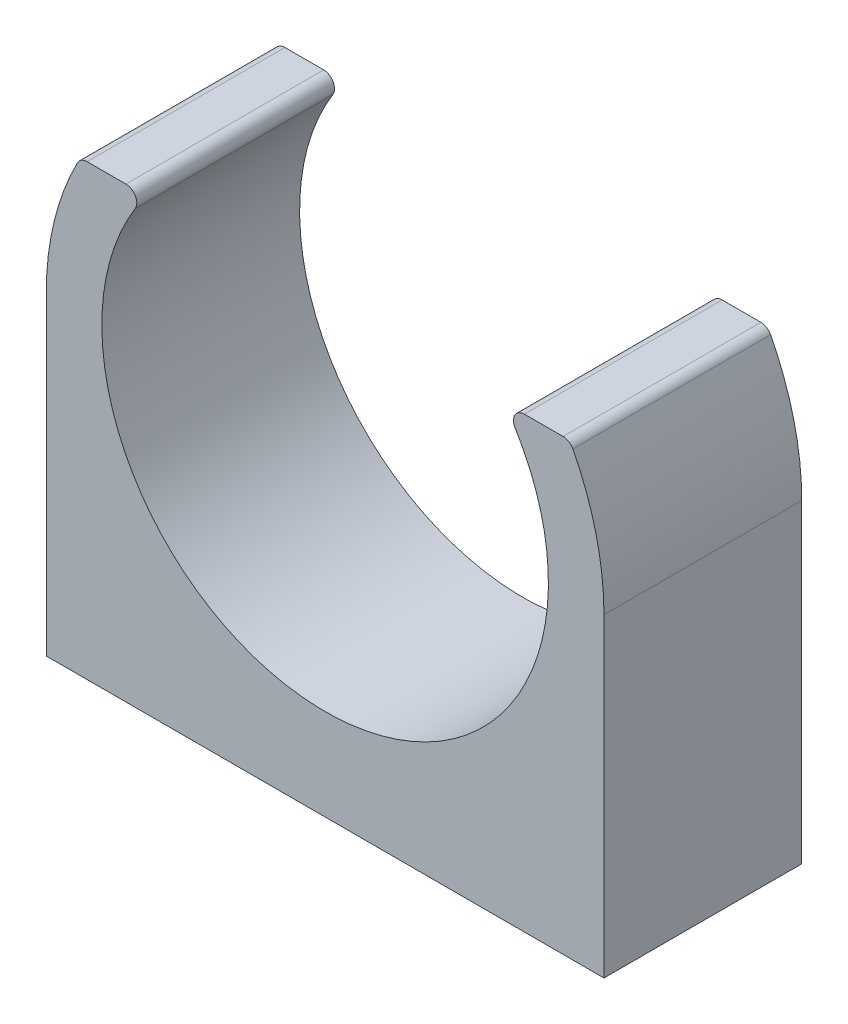
ISO-10303-21;
HEADER;
FILE_DESCRIPTION(('STEP AP214'),'2;1');
FILE_NAME('part.step','',(''),(''),'','','');
FILE_SCHEMA(('AUTOMOTIVE_DESIGN { 1 0 10303 214 1 1 1 1 }'));
ENDSEC;
DATA;
#1=APPLICATION_CONTEXT('core data for automotive mechanical design processes');
#2=APPLICATION_PROTOCOL_DEFINITION('international standard','automotive_design',2000,#1);
#3=PRODUCT_CONTEXT('',#1,'mechanical');
#4=PRODUCT('Part','Part','',(#3));
#5=PRODUCT_RELATED_PRODUCT_CATEGORY('part','',(#4));
#6=PRODUCT_DEFINITION_FORMATION('','',#4);
#7=PRODUCT_DEFINITION_CONTEXT('part definition',#1,'design');
#8=PRODUCT_DEFINITION('design','',#6,#7);
#9=PRODUCT_DEFINITION_SHAPE('','',#8);
#10=(LENGTH_UNIT() NAMED_UNIT(*) SI_UNIT(.MILLI.,.METRE.));
#11=(NAMED_UNIT(*) PLANE_ANGLE_UNIT() SI_UNIT($,.RADIAN.));
#12=(NAMED_UNIT(*) SI_UNIT($,.STERADIAN.) SOLID_ANGLE_UNIT());
#13=UNCERTAINTY_MEASURE_WITH_UNIT(LENGTH_MEASURE(1.E-05),#10,'distance_accuracy_value','');
#14=(GEOMETRIC_REPRESENTATION_CONTEXT(3) GLOBAL_UNCERTAINTY_ASSIGNED_CONTEXT((#13)) GLOBAL_UNIT_ASSIGNED_CONTEXT((#10,
#11,#12)) REPRESENTATION_CONTEXT('',''));
#15=CARTESIAN_POINT('',(0.,0.,0.));
#16=DIRECTION('',(0.,0.,1.));
#17=DIRECTION('',(1.,0.,0.));
#18=AXIS2_PLACEMENT_3D('',#15,#16,#17);
#19=CARTESIAN_POINT('',(21.15,0.,15.));
#20=DIRECTION('',(-1.,0.,0.));
#21=DIRECTION('',(0.,-1.,0.));
#22=AXIS2_PLACEMENT_3D('',#19,#20,#21);
#23=PLANE('',#22);
#24=DIRECTION('',(0.,1.,0.));
#25=VECTOR('',#24,1.);
#26=CARTESIAN_POINT('',(21.15,0.,0.));
#27=LINE('',#26,#25);
#28=CARTESIAN_POINT('',(21.15,-3.75,0.));
#29=VERTEX_POINT('',#28);
#30=CARTESIAN_POINT('',(21.15,20.11120000485,0.));
#31=VERTEX_POINT('',#30);
#32=EDGE_CURVE('E159',#29,#31,#27,.T.);
#33=ORIENTED_EDGE('',*,*,#32,.T.);
#34=DIRECTION('',(0.,0.,-1.));
#35=VECTOR('',#34,1.);
#36=CARTESIAN_POINT('',(21.15,20.11120000485,15.));
#37=LINE('',#36,#35);
#38=CARTESIAN_POINT('',(21.15,20.11120000485,15.));
#39=VERTEX_POINT('',#38);
#40=EDGE_CURVE('E140',#39,#31,#37,.T.);
#41=ORIENTED_EDGE('',*,*,#40,.F.);
#42=DIRECTION('',(0.,1.,0.));
#43=VECTOR('',#42,1.);
#44=CARTESIAN_POINT('',(21.15,0.,15.));
#45=LINE('',#44,#43);
#46=CARTESIAN_POINT('',(21.15,-3.75,15.));
#47=VERTEX_POINT('',#46);
#48=EDGE_CURVE('E146',#47,#39,#45,.T.);
#49=ORIENTED_EDGE('',*,*,#48,.F.);
#50=DIRECTION('',(0.,0.,-1.));
#51=VECTOR('',#50,1.);
#52=CARTESIAN_POINT('',(21.15,-3.75,15.));
#53=LINE('',#52,#51);
#54=EDGE_CURVE('E230',#47,#29,#53,.T.);
#55=ORIENTED_EDGE('',*,*,#54,.T.);
#56=EDGE_LOOP('',(#33,#41,#49,#55));
#57=FACE_BOUND('',#56,.T.);
#58=ADVANCED_FACE('F45',(#57),#23,.F.);
#59=CARTESIAN_POINT('',(0.,20.11120000485,15.));
#60=DIRECTION('',(0.,0.,-1.));
#61=DIRECTION('',(-1.,0.,0.));
#62=AXIS2_PLACEMENT_3D('',#59,#60,#61);
#63=CYLINDRICAL_SURFACE('',#62,21.15);
#64=CARTESIAN_POINT('',(0.,20.11120000485,0.));
#65=DIRECTION('',(0.,0.,1.));
#66=DIRECTION('',(1.,0.,0.));
#67=AXIS2_PLACEMENT_3D('',#64,#65,#66);
#68=CIRCLE('',#67,21.15);
#69=CARTESIAN_POINT('',(18.787439693829,29.8248301064515,0.));
#70=VERTEX_POINT('',#69);
#71=EDGE_CURVE('E253',#31,#70,#68,.T.);
#72=ORIENTED_EDGE('',*,*,#71,.T.);
#73=DIRECTION('',(0.,0.,-1.));
#74=VECTOR('',#73,1.);
#75=CARTESIAN_POINT('',(18.787439693829,29.8248301064515,15.));
#76=LINE('',#75,#74);
#77=CARTESIAN_POINT('',(18.787439693829,29.8248301064515,15.));
#78=VERTEX_POINT('',#77);
#79=EDGE_CURVE('E143',#70,#78,#76,.F.);
#80=ORIENTED_EDGE('',*,*,#79,.T.);
#81=CARTESIAN_POINT('',(0.,20.11120000485,15.));
#82=DIRECTION('',(0.,0.,1.));
#83=DIRECTION('',(1.,0.,0.));
#84=AXIS2_PLACEMENT_3D('',#81,#82,#83);
#85=CIRCLE('',#84,21.15);
#86=EDGE_CURVE('E135',#39,#78,#85,.T.);
#87=ORIENTED_EDGE('',*,*,#86,.F.);
#88=ORIENTED_EDGE('',*,*,#40,.T.);
#89=EDGE_LOOP('',(#72,#80,#87,#88));
#90=FACE_BOUND('',#89,.T.);
#91=ADVANCED_FACE('F138',(#90),#63,.T.);
#92=CARTESIAN_POINT('',(0.,30.27120000485,15.));
#93=DIRECTION('',(0.,1.,0.));
#94=DIRECTION('',(0.,0.,1.));
#95=AXIS2_PLACEMENT_3D('',#92,#93,#94);
#96=PLANE('',#95);
#97=DIRECTION('',(1.,0.,0.));
#98=VECTOR('',#97,1.);
#99=CARTESIAN_POINT('',(0.,30.27120000485,15.));
#100=LINE('',#99,#98);
#101=CARTESIAN_POINT('',(15.1110918471263,30.27120000485,15.));
#102=VERTEX_POINT('',#101);
#103=CARTESIAN_POINT('',(18.054152154006,30.27120000485,15.));
#104=VERTEX_POINT('',#103);
#105=EDGE_CURVE('E145',#102,#104,#100,.T.);
#106=ORIENTED_EDGE('',*,*,#105,.T.);
#107=DIRECTION('',(0.,0.,1.));
#108=VECTOR('',#107,1.);
#109=CARTESIAN_POINT('',(18.054152154006,30.27120000485,0.));
#110=LINE('',#109,#108);
#111=CARTESIAN_POINT('',(18.054152154006,30.27120000485,0.));
#112=VERTEX_POINT('',#111);
#113=EDGE_CURVE('E163',#104,#112,#110,.F.);
#114=ORIENTED_EDGE('',*,*,#113,.T.);
#115=DIRECTION('',(1.,0.,0.));
#116=VECTOR('',#115,1.);
#117=CARTESIAN_POINT('',(0.,30.27120000485,0.));
#118=LINE('',#117,#116);
#119=CARTESIAN_POINT('',(15.1110918471263,30.27120000485,0.));
#120=VERTEX_POINT('',#119);
#121=EDGE_CURVE('E223',#120,#112,#118,.T.);
#122=ORIENTED_EDGE('',*,*,#121,.F.);
#123=DIRECTION('',(0.,0.,-1.));
#124=VECTOR('',#123,1.);
#125=CARTESIAN_POINT('',(15.1110918471263,30.27120000485,15.));
#126=LINE('',#125,#124);
#127=EDGE_CURVE('E160',#120,#102,#126,.F.);
#128=ORIENTED_EDGE('',*,*,#127,.T.);
#129=EDGE_LOOP('',(#106,#114,#122,#128));
#130=FACE_BOUND('',#129,.T.);
#131=ADVANCED_FACE('F258',(#130),#96,.T.);
#132=CARTESIAN_POINT('',(0.,20.11120000485,15.));
#133=DIRECTION('',(0.,0.,-1.));
#134=DIRECTION('',(-1.,0.,0.));
#135=AXIS2_PLACEMENT_3D('',#132,#133,#134);
#136=CYLINDRICAL_SURFACE('',#135,16.93620000485);
#137=CARTESIAN_POINT('',(0.,20.11120000485,15.));
#138=DIRECTION('',(0.,0.,1.));
#139=DIRECTION('',(1.,0.,0.));
#140=AXIS2_PLACEMENT_3D('',#137,#138,#139);
#141=CIRCLE('',#140,16.93620000485);
#142=CARTESIAN_POINT('',(-14.4087825908954,29.0118659828872,15.));
#143=VERTEX_POINT('',#142);
#144=CARTESIAN_POINT('',(14.4087825908954,29.0118659828872,15.));
#145=VERTEX_POINT('',#144);
#146=EDGE_CURVE('E199',#143,#145,#141,.T.);
#147=ORIENTED_EDGE('',*,*,#146,.T.);
#148=DIRECTION('',(0.,0.,-1.));
#149=VECTOR('',#148,1.);
#150=CARTESIAN_POINT('',(14.4087825908954,29.0118659828872,15.));
#151=LINE('',#150,#149);
#152=CARTESIAN_POINT('',(14.4087825908954,29.0118659828872,0.));
#153=VERTEX_POINT('',#152);
#154=EDGE_CURVE('E11',#145,#153,#151,.T.);
#155=ORIENTED_EDGE('',*,*,#154,.T.);
#156=CARTESIAN_POINT('',(0.,20.11120000485,0.));
#157=DIRECTION('',(0.,0.,1.));
#158=DIRECTION('',(1.,0.,0.));
#159=AXIS2_PLACEMENT_3D('',#156,#157,#158);
#160=CIRCLE('',#159,16.93620000485);
#161=CARTESIAN_POINT('',(-14.4087825908954,29.0118659828872,0.));
#162=VERTEX_POINT('',#161);
#163=EDGE_CURVE('E202',#162,#153,#160,.T.);
#164=ORIENTED_EDGE('',*,*,#163,.F.);
#165=DIRECTION('',(0.,0.,-1.));
#166=VECTOR('',#165,1.);
#167=CARTESIAN_POINT('',(-14.4087825908954,29.0118659828872,15.));
#168=LINE('',#167,#166);
#169=EDGE_CURVE('E53',#162,#143,#168,.F.);
#170=ORIENTED_EDGE('',*,*,#169,.T.);
#171=EDGE_LOOP('',(#147,#155,#164,#170));
#172=FACE_BOUND('',#171,.T.);
#173=ADVANCED_FACE('F198',(#172),#136,.F.);
#174=CARTESIAN_POINT('',(0.,30.27120000485,15.));
#175=DIRECTION('',(0.,1.,0.));
#176=DIRECTION('',(0.,0.,1.));
#177=AXIS2_PLACEMENT_3D('',#174,#175,#176);
#178=PLANE('',#177);
#179=DIRECTION('',(1.,0.,0.));
#180=VECTOR('',#179,1.);
#181=CARTESIAN_POINT('',(0.,30.27120000485,0.));
#182=LINE('',#181,#180);
#183=CARTESIAN_POINT('',(-18.054152154006,30.27120000485,0.));
#184=VERTEX_POINT('',#183);
#185=CARTESIAN_POINT('',(-15.1110918471263,30.27120000485,0.));
#186=VERTEX_POINT('',#185);
#187=EDGE_CURVE('E213',#184,#186,#182,.T.);
#188=ORIENTED_EDGE('',*,*,#187,.F.);
#189=DIRECTION('',(0.,0.,1.));
#190=VECTOR('',#189,1.);
#191=CARTESIAN_POINT('',(-18.054152154006,30.27120000485,15.));
#192=LINE('',#191,#190);
#193=CARTESIAN_POINT('',(-18.054152154006,30.27120000485,15.));
#194=VERTEX_POINT('',#193);
#195=EDGE_CURVE('E193',#184,#194,#192,.T.);
#196=ORIENTED_EDGE('',*,*,#195,.T.);
#197=DIRECTION('',(1.,0.,0.));
#198=VECTOR('',#197,1.);
#199=CARTESIAN_POINT('',(0.,30.27120000485,15.));
#200=LINE('',#199,#198);
#201=CARTESIAN_POINT('',(-15.1110918471263,30.27120000485,15.));
#202=VERTEX_POINT('',#201);
#203=EDGE_CURVE('E206',#194,#202,#200,.T.);
#204=ORIENTED_EDGE('',*,*,#203,.T.);
#205=DIRECTION('',(0.,0.,-1.));
#206=VECTOR('',#205,1.);
#207=CARTESIAN_POINT('',(-15.1110918471263,30.27120000485,15.));
#208=LINE('',#207,#206);
#209=EDGE_CURVE('E190',#202,#186,#208,.T.);
#210=ORIENTED_EDGE('',*,*,#209,.T.);
#211=EDGE_LOOP('',(#188,#196,#204,#210));
#212=FACE_BOUND('',#211,.T.);
#213=ADVANCED_FACE('F212',(#212),#178,.T.);
#214=CARTESIAN_POINT('',(0.,20.11120000485,15.));
#215=DIRECTION('',(0.,0.,-1.));
#216=DIRECTION('',(-1.,0.,0.));
#217=AXIS2_PLACEMENT_3D('',#214,#215,#216);
#218=CYLINDRICAL_SURFACE('',#217,21.15);
#219=CARTESIAN_POINT('',(0.,20.11120000485,15.));
#220=DIRECTION('',(0.,0.,1.));
#221=DIRECTION('',(1.,0.,0.));
#222=AXIS2_PLACEMENT_3D('',#219,#220,#221);
#223=CIRCLE('',#222,21.15);
#224=CARTESIAN_POINT('',(-18.787439693829,29.8248301064515,15.));
#225=VERTEX_POINT('',#224);
#226=CARTESIAN_POINT('',(-21.15,20.11120000485,15.));
#227=VERTEX_POINT('',#226);
#228=EDGE_CURVE('E242',#225,#227,#223,.T.);
#229=ORIENTED_EDGE('',*,*,#228,.F.);
#230=DIRECTION('',(0.,0.,-1.));
#231=VECTOR('',#230,1.);
#232=CARTESIAN_POINT('',(-18.787439693829,29.8248301064515,15.));
#233=LINE('',#232,#231);
#234=CARTESIAN_POINT('',(-18.787439693829,29.8248301064515,0.));
#235=VERTEX_POINT('',#234);
#236=EDGE_CURVE('E187',#225,#235,#233,.T.);
#237=ORIENTED_EDGE('',*,*,#236,.T.);
#238=CARTESIAN_POINT('',(0.,20.11120000485,0.));
#239=DIRECTION('',(0.,0.,1.));
#240=DIRECTION('',(1.,0.,0.));
#241=AXIS2_PLACEMENT_3D('',#238,#239,#240);
#242=CIRCLE('',#241,21.15);
#243=CARTESIAN_POINT('',(-21.15,20.11120000485,0.));
#244=VERTEX_POINT('',#243);
#245=EDGE_CURVE('E219',#235,#244,#242,.T.);
#246=ORIENTED_EDGE('',*,*,#245,.T.);
#247=DIRECTION('',(0.,0.,-1.));
#248=VECTOR('',#247,1.);
#249=CARTESIAN_POINT('',(-21.15,20.11120000485,15.));
#250=LINE('',#249,#248);
#251=EDGE_CURVE('E161',#227,#244,#250,.T.);
#252=ORIENTED_EDGE('',*,*,#251,.F.);
#253=EDGE_LOOP('',(#229,#237,#246,#252));
#254=FACE_BOUND('',#253,.T.);
#255=ADVANCED_FACE('F241',(#254),#218,.T.);
#256=CARTESIAN_POINT('',(-21.15,0.,15.));
#257=DIRECTION('',(-1.,0.,0.));
#258=DIRECTION('',(0.,-1.,0.));
#259=AXIS2_PLACEMENT_3D('',#256,#257,#258);
#260=PLANE('',#259);
#261=DIRECTION('',(0.,1.,0.));
#262=VECTOR('',#261,1.);
#263=CARTESIAN_POINT('',(-21.15,0.,0.));
#264=LINE('',#263,#262);
#265=CARTESIAN_POINT('',(-21.15,-3.75,0.));
#266=VERTEX_POINT('',#265);
#267=EDGE_CURVE('E221',#266,#244,#264,.T.);
#268=ORIENTED_EDGE('',*,*,#267,.F.);
#269=DIRECTION('',(0.,0.,-1.));
#270=VECTOR('',#269,1.);
#271=CARTESIAN_POINT('',(-21.15,-3.75,15.));
#272=LINE('',#271,#270);
#273=CARTESIAN_POINT('',(-21.15,-3.75,15.));
#274=VERTEX_POINT('',#273);
#275=EDGE_CURVE('E166',#274,#266,#272,.T.);
#276=ORIENTED_EDGE('',*,*,#275,.F.);
#277=DIRECTION('',(0.,1.,0.));
#278=VECTOR('',#277,1.);
#279=CARTESIAN_POINT('',(-21.15,0.,15.));
#280=LINE('',#279,#278);
#281=EDGE_CURVE('E239',#274,#227,#280,.T.);
#282=ORIENTED_EDGE('',*,*,#281,.T.);
#283=ORIENTED_EDGE('',*,*,#251,.T.);
#284=EDGE_LOOP('',(#268,#276,#282,#283));
#285=FACE_BOUND('',#284,.T.);
#286=ADVANCED_FACE('F237',(#285),#260,.T.);
#287=CARTESIAN_POINT('',(0.,-3.75,15.));
#288=DIRECTION('',(0.,1.,0.));
#289=DIRECTION('',(0.,0.,1.));
#290=AXIS2_PLACEMENT_3D('',#287,#288,#289);
#291=PLANE('',#290);
#292=DIRECTION('',(1.,0.,0.));
#293=VECTOR('',#292,1.);
#294=CARTESIAN_POINT('',(0.,-3.75,0.));
#295=LINE('',#294,#293);
#296=EDGE_CURVE('E156',#266,#29,#295,.T.);
#297=ORIENTED_EDGE('',*,*,#296,.T.);
#298=ORIENTED_EDGE('',*,*,#54,.F.);
#299=DIRECTION('',(1.,0.,0.));
#300=VECTOR('',#299,1.);
#301=CARTESIAN_POINT('',(0.,-3.75,15.));
#302=LINE('',#301,#300);
#303=EDGE_CURVE('E152',#274,#47,#302,.T.);
#304=ORIENTED_EDGE('',*,*,#303,.F.);
#305=ORIENTED_EDGE('',*,*,#275,.T.);
#306=EDGE_LOOP('',(#297,#298,#304,#305));
#307=FACE_BOUND('',#306,.T.);
#308=ADVANCED_FACE('F233',(#307),#291,.F.);
#309=CARTESIAN_POINT('',(0.,0.,15.));
#310=DIRECTION('',(0.,0.,1.));
#311=DIRECTION('',(1.,0.,0.));
#312=AXIS2_PLACEMENT_3D('',#309,#310,#311);
#313=PLANE('',#312);
#314=ORIENTED_EDGE('',*,*,#86,.T.);
#315=CARTESIAN_POINT('',(18.054152154006,29.44570000485,15.));
#316=DIRECTION('',(0.,0.,1.));
#317=DIRECTION('',(1.,0.,0.));
#318=AXIS2_PLACEMENT_3D('',#315,#316,#317);
#319=CIRCLE('',#318,0.8255);
#320=EDGE_CURVE('E185',#78,#104,#319,.T.);
#321=ORIENTED_EDGE('',*,*,#320,.T.);
#322=ORIENTED_EDGE('',*,*,#105,.F.);
#323=CARTESIAN_POINT('',(15.1110918471263,29.44570000485,15.));
#324=DIRECTION('',(0.,0.,1.));
#325=DIRECTION('',(1.,0.,0.));
#326=AXIS2_PLACEMENT_3D('',#323,#324,#325);
#327=CIRCLE('',#326,0.8255);
#328=EDGE_CURVE('E182',#102,#145,#327,.T.);
#329=ORIENTED_EDGE('',*,*,#328,.T.);
#330=ORIENTED_EDGE('',*,*,#146,.F.);
#331=CARTESIAN_POINT('',(-15.1110918471263,29.44570000485,15.));
#332=DIRECTION('',(0.,0.,1.));
#333=DIRECTION('',(1.,0.,0.));
#334=AXIS2_PLACEMENT_3D('',#331,#332,#333);
#335=CIRCLE('',#334,0.8255);
#336=EDGE_CURVE('E66',#143,#202,#335,.T.);
#337=ORIENTED_EDGE('',*,*,#336,.T.);
#338=ORIENTED_EDGE('',*,*,#203,.F.);
#339=CARTESIAN_POINT('',(-18.054152154006,29.44570000485,15.));
#340=DIRECTION('',(0.,0.,1.));
#341=DIRECTION('',(1.,0.,0.));
#342=AXIS2_PLACEMENT_3D('',#339,#340,#341);
#343=CIRCLE('',#342,0.8255);
#344=EDGE_CURVE('E60',#194,#225,#343,.T.);
#345=ORIENTED_EDGE('',*,*,#344,.T.);
#346=ORIENTED_EDGE('',*,*,#228,.T.);
#347=ORIENTED_EDGE('',*,*,#281,.F.);
#348=ORIENTED_EDGE('',*,*,#303,.T.);
#349=ORIENTED_EDGE('',*,*,#48,.T.);
#350=EDGE_LOOP('',(#314,#321,#322,#329,#330,#337,#338,#345,#346,#347,#348,#349));
#351=FACE_BOUND('',#350,.T.);
#352=ADVANCED_FACE('F149',(#351),#313,.T.);
#353=CARTESIAN_POINT('',(0.,0.,0.));
#354=DIRECTION('',(0.,0.,1.));
#355=DIRECTION('',(1.,0.,0.));
#356=AXIS2_PLACEMENT_3D('',#353,#354,#355);
#357=PLANE('',#356);
#358=ORIENTED_EDGE('',*,*,#121,.T.);
#359=CARTESIAN_POINT('',(18.054152154006,29.44570000485,0.));
#360=DIRECTION('',(0.,0.,1.));
#361=DIRECTION('',(1.,0.,0.));
#362=AXIS2_PLACEMENT_3D('',#359,#360,#361);
#363=CIRCLE('',#362,0.8255);
#364=EDGE_CURVE('E178',#112,#70,#363,.F.);
#365=ORIENTED_EDGE('',*,*,#364,.T.);
#366=ORIENTED_EDGE('',*,*,#71,.F.);
#367=ORIENTED_EDGE('',*,*,#32,.F.);
#368=ORIENTED_EDGE('',*,*,#296,.F.);
#369=ORIENTED_EDGE('',*,*,#267,.T.);
#370=ORIENTED_EDGE('',*,*,#245,.F.);
#371=CARTESIAN_POINT('',(-18.054152154006,29.44570000485,0.));
#372=DIRECTION('',(0.,0.,1.));
#373=DIRECTION('',(1.,0.,0.));
#374=AXIS2_PLACEMENT_3D('',#371,#372,#373);
#375=CIRCLE('',#374,0.8255);
#376=EDGE_CURVE('E176',#235,#184,#375,.F.);
#377=ORIENTED_EDGE('',*,*,#376,.T.);
#378=ORIENTED_EDGE('',*,*,#187,.T.);
#379=CARTESIAN_POINT('',(-15.1110918471263,29.44570000485,0.));
#380=DIRECTION('',(0.,0.,1.));
#381=DIRECTION('',(1.,0.,0.));
#382=AXIS2_PLACEMENT_3D('',#379,#380,#381);
#383=CIRCLE('',#382,0.8255);
#384=EDGE_CURVE('E172',#186,#162,#383,.F.);
#385=ORIENTED_EDGE('',*,*,#384,.T.);
#386=ORIENTED_EDGE('',*,*,#163,.T.);
#387=CARTESIAN_POINT('',(15.1110918471263,29.44570000485,0.));
#388=DIRECTION('',(0.,0.,1.));
#389=DIRECTION('',(1.,0.,0.));
#390=AXIS2_PLACEMENT_3D('',#387,#388,#389);
#391=CIRCLE('',#390,0.8255);
#392=EDGE_CURVE('E174',#153,#120,#391,.F.);
#393=ORIENTED_EDGE('',*,*,#392,.T.);
#394=EDGE_LOOP('',(#358,#365,#366,#367,#368,#369,#370,#377,#378,#385,#386,#393));
#395=FACE_BOUND('',#394,.T.);
#396=ADVANCED_FACE('F217',(#395),#357,.F.);
#397=CARTESIAN_POINT('',(18.054152154006,29.44570000485,15.));
#398=DIRECTION('',(0.,0.,-1.));
#399=DIRECTION('',(-1.,0.,0.));
#400=AXIS2_PLACEMENT_3D('',#397,#398,#399);
#401=CYLINDRICAL_SURFACE('',#400,0.8255);
#402=ORIENTED_EDGE('',*,*,#320,.F.);
#403=ORIENTED_EDGE('',*,*,#79,.F.);
#404=ORIENTED_EDGE('',*,*,#364,.F.);
#405=ORIENTED_EDGE('',*,*,#113,.F.);
#406=EDGE_LOOP('',(#402,#403,#404,#405));
#407=FACE_BOUND('',#406,.T.);
#408=ADVANCED_FACE('F267',(#407),#401,.T.);
#409=CARTESIAN_POINT('',(-18.054152154006,29.44570000485,15.));
#410=DIRECTION('',(0.,0.,-1.));
#411=DIRECTION('',(-1.,0.,0.));
#412=AXIS2_PLACEMENT_3D('',#409,#410,#411);
#413=CYLINDRICAL_SURFACE('',#412,0.8255);
#414=ORIENTED_EDGE('',*,*,#344,.F.);
#415=ORIENTED_EDGE('',*,*,#195,.F.);
#416=ORIENTED_EDGE('',*,*,#376,.F.);
#417=ORIENTED_EDGE('',*,*,#236,.F.);
#418=EDGE_LOOP('',(#414,#415,#416,#417));
#419=FACE_BOUND('',#418,.T.);
#420=ADVANCED_FACE('F245',(#419),#413,.T.);
#421=CARTESIAN_POINT('',(15.1110918471263,29.44570000485,15.));
#422=DIRECTION('',(0.,0.,-1.));
#423=DIRECTION('',(-1.,0.,0.));
#424=AXIS2_PLACEMENT_3D('',#421,#422,#423);
#425=CYLINDRICAL_SURFACE('',#424,0.8255);
#426=ORIENTED_EDGE('',*,*,#328,.F.);
#427=ORIENTED_EDGE('',*,*,#127,.F.);
#428=ORIENTED_EDGE('',*,*,#392,.F.);
#429=ORIENTED_EDGE('',*,*,#154,.F.);
#430=EDGE_LOOP('',(#426,#427,#428,#429));
#431=FACE_BOUND('',#430,.T.);
#432=ADVANCED_FACE('F261',(#431),#425,.T.);
#433=CARTESIAN_POINT('',(-15.1110918471263,29.44570000485,15.));
#434=DIRECTION('',(0.,0.,-1.));
#435=DIRECTION('',(-1.,0.,0.));
#436=AXIS2_PLACEMENT_3D('',#433,#434,#435);
#437=CYLINDRICAL_SURFACE('',#436,0.8255);
#438=ORIENTED_EDGE('',*,*,#336,.F.);
#439=ORIENTED_EDGE('',*,*,#169,.F.);
#440=ORIENTED_EDGE('',*,*,#384,.F.);
#441=ORIENTED_EDGE('',*,*,#209,.F.);
#442=EDGE_LOOP('',(#438,#439,#440,#441));
#443=FACE_BOUND('',#442,.T.);
#444=ADVANCED_FACE('F47',(#443),#437,.T.);
#445=CLOSED_SHELL('',(#58,#91,#131,#173,#213,#255,#286,#308,#352,#396,#408,#420,#432,#444));
#446=MANIFOLD_SOLID_BREP('B2',#445);
#447=ADVANCED_BREP_SHAPE_REPRESENTATION('',(#18,#446),#14);
#448=SHAPE_DEFINITION_REPRESENTATION(#9,#447);
ENDSEC;
END-ISO-10303-21;
